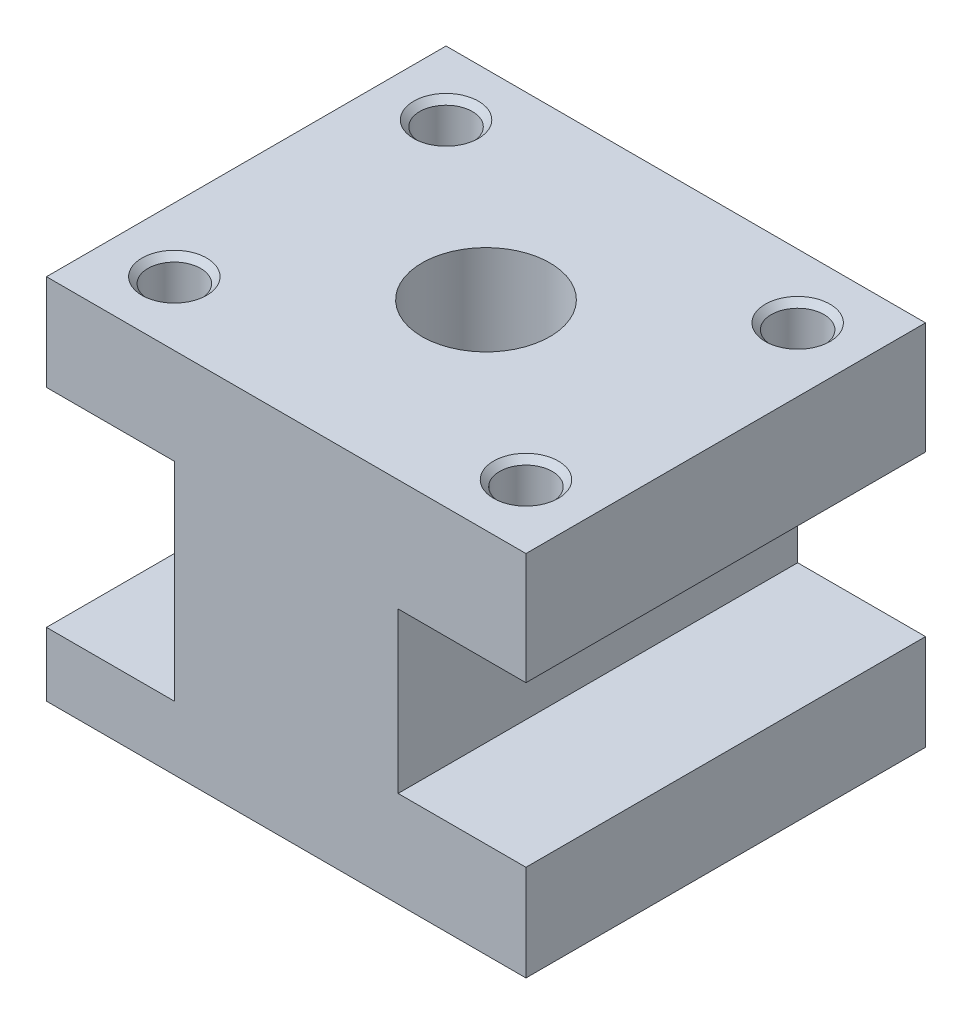
ISO-10303-21;
HEADER;
FILE_DESCRIPTION(('STEP AP214'),'2;1');
FILE_NAME('part.step','',(''),(''),'','','');
FILE_SCHEMA(('AUTOMOTIVE_DESIGN { 1 0 10303 214 1 1 1 1 }'));
ENDSEC;
DATA;
#1=APPLICATION_CONTEXT('core data for automotive mechanical design processes');
#2=APPLICATION_PROTOCOL_DEFINITION('international standard','automotive_design',2000,#1);
#3=PRODUCT_CONTEXT('',#1,'mechanical');
#4=PRODUCT('Part','Part','',(#3));
#5=PRODUCT_RELATED_PRODUCT_CATEGORY('part','',(#4));
#6=PRODUCT_DEFINITION_FORMATION('','',#4);
#7=PRODUCT_DEFINITION_CONTEXT('part definition',#1,'design');
#8=PRODUCT_DEFINITION('design','',#6,#7);
#9=PRODUCT_DEFINITION_SHAPE('','',#8);
#10=(LENGTH_UNIT() NAMED_UNIT(*) SI_UNIT(.MILLI.,.METRE.));
#11=(NAMED_UNIT(*) PLANE_ANGLE_UNIT() SI_UNIT($,.RADIAN.));
#12=(NAMED_UNIT(*) SI_UNIT($,.STERADIAN.) SOLID_ANGLE_UNIT());
#13=UNCERTAINTY_MEASURE_WITH_UNIT(LENGTH_MEASURE(1.E-05),#10,'distance_accuracy_value','');
#14=(GEOMETRIC_REPRESENTATION_CONTEXT(3) GLOBAL_UNCERTAINTY_ASSIGNED_CONTEXT((#13)) GLOBAL_UNIT_ASSIGNED_CONTEXT((#10,
#11,#12)) REPRESENTATION_CONTEXT('',''));
#15=CARTESIAN_POINT('',(0.,0.,0.));
#16=DIRECTION('',(0.,0.,1.));
#17=DIRECTION('',(1.,0.,0.));
#18=AXIS2_PLACEMENT_3D('',#15,#16,#17);
#19=CARTESIAN_POINT('',(15.,23.,12.5));
#20=DIRECTION('',(0.,-1.,0.));
#21=DIRECTION('',(0.,0.,-1.));
#22=AXIS2_PLACEMENT_3D('',#19,#20,#21);
#23=PLANE('',#22);
#24=CARTESIAN_POINT('',(0.,23.,0.));
#25=DIRECTION('',(0.,1.,0.));
#26=DIRECTION('',(0.,0.,1.));
#27=AXIS2_PLACEMENT_3D('',#24,#25,#26);
#28=CIRCLE('',#27,4.);
#29=CARTESIAN_POINT('',(0.,23.,4.));
#30=VERTEX_POINT('',#29);
#31=EDGE_CURVE('E292',#30,#30,#28,.T.);
#32=ORIENTED_EDGE('',*,*,#31,.F.);
#33=EDGE_LOOP('',(#32));
#34=FACE_BOUND('',#33,.T.);
#35=CARTESIAN_POINT('',(11.,23.,8.5));
#36=DIRECTION('',(0.,1.,0.));
#37=DIRECTION('',(0.,0.,1.));
#38=AXIS2_PLACEMENT_3D('',#35,#36,#37);
#39=CIRCLE('',#38,2.025);
#40=CARTESIAN_POINT('',(11.,23.,10.525));
#41=VERTEX_POINT('',#40);
#42=EDGE_CURVE('E305',#41,#41,#39,.T.);
#43=ORIENTED_EDGE('',*,*,#42,.F.);
#44=EDGE_LOOP('',(#43));
#45=FACE_BOUND('',#44,.T.);
#46=CARTESIAN_POINT('',(11.,23.,-8.5));
#47=DIRECTION('',(0.,1.,0.));
#48=DIRECTION('',(0.,0.,1.));
#49=AXIS2_PLACEMENT_3D('',#46,#47,#48);
#50=CIRCLE('',#49,2.025);
#51=CARTESIAN_POINT('',(11.,23.,-6.475));
#52=VERTEX_POINT('',#51);
#53=EDGE_CURVE('E323',#52,#52,#50,.T.);
#54=ORIENTED_EDGE('',*,*,#53,.F.);
#55=EDGE_LOOP('',(#54));
#56=FACE_BOUND('',#55,.T.);
#57=DIRECTION('',(-1.,0.,0.));
#58=VECTOR('',#57,1.);
#59=CARTESIAN_POINT('',(15.,23.,-12.5));
#60=LINE('',#59,#58);
#61=CARTESIAN_POINT('',(15.,23.,-12.5));
#62=VERTEX_POINT('',#61);
#63=CARTESIAN_POINT('',(-15.,23.,-12.5));
#64=VERTEX_POINT('',#63);
#65=EDGE_CURVE('E174',#62,#64,#60,.T.);
#66=ORIENTED_EDGE('',*,*,#65,.T.);
#67=DIRECTION('',(0.,0.,-1.));
#68=VECTOR('',#67,1.);
#69=CARTESIAN_POINT('',(-15.,23.,12.5));
#70=LINE('',#69,#68);
#71=CARTESIAN_POINT('',(-15.,23.,12.5));
#72=VERTEX_POINT('',#71);
#73=EDGE_CURVE('E185',#72,#64,#70,.T.);
#74=ORIENTED_EDGE('',*,*,#73,.F.);
#75=DIRECTION('',(-1.,0.,0.));
#76=VECTOR('',#75,1.);
#77=CARTESIAN_POINT('',(15.,23.,12.5));
#78=LINE('',#77,#76);
#79=CARTESIAN_POINT('',(15.,23.,12.5));
#80=VERTEX_POINT('',#79);
#81=EDGE_CURVE('E234',#80,#72,#78,.T.);
#82=ORIENTED_EDGE('',*,*,#81,.F.);
#83=DIRECTION('',(0.,0.,-1.));
#84=VECTOR('',#83,1.);
#85=CARTESIAN_POINT('',(15.,23.,12.5));
#86=LINE('',#85,#84);
#87=EDGE_CURVE('E188',#80,#62,#86,.T.);
#88=ORIENTED_EDGE('',*,*,#87,.T.);
#89=EDGE_LOOP('',(#66,#74,#82,#88));
#90=FACE_BOUND('',#89,.T.);
#91=CARTESIAN_POINT('',(-11.,23.,-8.5));
#92=DIRECTION('',(0.,1.,0.));
#93=DIRECTION('',(0.,0.,1.));
#94=AXIS2_PLACEMENT_3D('',#91,#92,#93);
#95=CIRCLE('',#94,2.025);
#96=CARTESIAN_POINT('',(-11.,23.,-6.475));
#97=VERTEX_POINT('',#96);
#98=EDGE_CURVE('E314',#97,#97,#95,.T.);
#99=ORIENTED_EDGE('',*,*,#98,.F.);
#100=EDGE_LOOP('',(#99));
#101=FACE_BOUND('',#100,.T.);
#102=CARTESIAN_POINT('',(-11.,23.,8.5));
#103=DIRECTION('',(0.,1.,0.));
#104=DIRECTION('',(0.,0.,1.));
#105=AXIS2_PLACEMENT_3D('',#102,#103,#104);
#106=CIRCLE('',#105,2.025);
#107=CARTESIAN_POINT('',(-11.,23.,10.525));
#108=VERTEX_POINT('',#107);
#109=EDGE_CURVE('E291',#108,#108,#106,.T.);
#110=ORIENTED_EDGE('',*,*,#109,.F.);
#111=EDGE_LOOP('',(#110));
#112=FACE_BOUND('',#111,.T.);
#113=ADVANCED_FACE('F37',(#34,#45,#56,#90,#101,#112),#23,.F.);
#114=CARTESIAN_POINT('',(-15.,4.,12.5));
#115=DIRECTION('',(1.,0.,0.));
#116=DIRECTION('',(0.,0.,-1.));
#117=AXIS2_PLACEMENT_3D('',#114,#115,#116);
#118=PLANE('',#117);
#119=DIRECTION('',(0.,-1.,0.));
#120=VECTOR('',#119,1.);
#121=CARTESIAN_POINT('',(-15.,4.,-12.5));
#122=LINE('',#121,#120);
#123=CARTESIAN_POINT('',(-15.,4.,-12.5));
#124=VERTEX_POINT('',#123);
#125=CARTESIAN_POINT('',(-15.,0.,-12.5));
#126=VERTEX_POINT('',#125);
#127=EDGE_CURVE('E158',#124,#126,#122,.T.);
#128=ORIENTED_EDGE('',*,*,#127,.T.);
#129=DIRECTION('',(0.,0.,-1.));
#130=VECTOR('',#129,1.);
#131=CARTESIAN_POINT('',(-15.,0.,12.5));
#132=LINE('',#131,#130);
#133=CARTESIAN_POINT('',(-15.,0.,12.5));
#134=VERTEX_POINT('',#133);
#135=EDGE_CURVE('E11',#134,#126,#132,.T.);
#136=ORIENTED_EDGE('',*,*,#135,.F.);
#137=DIRECTION('',(0.,-1.,0.));
#138=VECTOR('',#137,1.);
#139=CARTESIAN_POINT('',(-15.,4.,12.5));
#140=LINE('',#139,#138);
#141=CARTESIAN_POINT('',(-15.,4.,12.5));
#142=VERTEX_POINT('',#141);
#143=EDGE_CURVE('E181',#142,#134,#140,.T.);
#144=ORIENTED_EDGE('',*,*,#143,.F.);
#145=DIRECTION('',(0.,0.,-1.));
#146=VECTOR('',#145,1.);
#147=CARTESIAN_POINT('',(-15.,4.,12.5));
#148=LINE('',#147,#146);
#149=EDGE_CURVE('E154',#142,#124,#148,.T.);
#150=ORIENTED_EDGE('',*,*,#149,.T.);
#151=EDGE_LOOP('',(#128,#136,#144,#150));
#152=FACE_BOUND('',#151,.T.);
#153=ADVANCED_FACE('F39',(#152),#118,.F.);
#154=CARTESIAN_POINT('',(-15.,0.,12.5));
#155=DIRECTION('',(0.,1.,0.));
#156=DIRECTION('',(-1.,0.,0.));
#157=AXIS2_PLACEMENT_3D('',#154,#155,#156);
#158=PLANE('',#157);
#159=CARTESIAN_POINT('',(0.,0.,0.));
#160=DIRECTION('',(0.,1.,0.));
#161=DIRECTION('',(0.,0.,1.));
#162=AXIS2_PLACEMENT_3D('',#159,#160,#161);
#163=CIRCLE('',#162,3.99999999999999);
#164=CARTESIAN_POINT('',(0.,0.,3.99999999999999));
#165=VERTEX_POINT('',#164);
#166=EDGE_CURVE('E289',#165,#165,#163,.T.);
#167=ORIENTED_EDGE('',*,*,#166,.T.);
#168=EDGE_LOOP('',(#167));
#169=FACE_BOUND('',#168,.T.);
#170=DIRECTION('',(1.,0.,0.));
#171=VECTOR('',#170,1.);
#172=CARTESIAN_POINT('',(-15.,0.,-12.5));
#173=LINE('',#172,#171);
#174=CARTESIAN_POINT('',(15.,0.,-12.5));
#175=VERTEX_POINT('',#174);
#176=EDGE_CURVE('E161',#126,#175,#173,.T.);
#177=ORIENTED_EDGE('',*,*,#176,.T.);
#178=DIRECTION('',(0.,0.,-1.));
#179=VECTOR('',#178,1.);
#180=CARTESIAN_POINT('',(15.,0.,12.5));
#181=LINE('',#180,#179);
#182=CARTESIAN_POINT('',(15.,0.,12.5));
#183=VERTEX_POINT('',#182);
#184=EDGE_CURVE('E46',#183,#175,#181,.T.);
#185=ORIENTED_EDGE('',*,*,#184,.F.);
#186=DIRECTION('',(1.,0.,0.));
#187=VECTOR('',#186,1.);
#188=CARTESIAN_POINT('',(-15.,0.,12.5));
#189=LINE('',#188,#187);
#190=EDGE_CURVE('E109',#134,#183,#189,.T.);
#191=ORIENTED_EDGE('',*,*,#190,.F.);
#192=ORIENTED_EDGE('',*,*,#135,.T.);
#193=EDGE_LOOP('',(#177,#185,#191,#192));
#194=FACE_BOUND('',#193,.T.);
#195=ADVANCED_FACE('F264',(#169,#194),#158,.F.);
#196=CARTESIAN_POINT('',(15.,0.,12.5));
#197=DIRECTION('',(-1.,0.,0.));
#198=DIRECTION('',(0.,0.,1.));
#199=AXIS2_PLACEMENT_3D('',#196,#197,#198);
#200=PLANE('',#199);
#201=DIRECTION('',(0.,1.,0.));
#202=VECTOR('',#201,1.);
#203=CARTESIAN_POINT('',(15.,0.,-12.5));
#204=LINE('',#203,#202);
#205=CARTESIAN_POINT('',(15.,6.00000000000001,-12.5));
#206=VERTEX_POINT('',#205);
#207=EDGE_CURVE('E164',#175,#206,#204,.T.);
#208=ORIENTED_EDGE('',*,*,#207,.T.);
#209=DIRECTION('',(0.,0.,-1.));
#210=VECTOR('',#209,1.);
#211=CARTESIAN_POINT('',(15.,6.00000000000001,12.5));
#212=LINE('',#211,#210);
#213=CARTESIAN_POINT('',(15.,6.00000000000001,12.5));
#214=VERTEX_POINT('',#213);
#215=EDGE_CURVE('E200',#214,#206,#212,.T.);
#216=ORIENTED_EDGE('',*,*,#215,.F.);
#217=DIRECTION('',(0.,1.,0.));
#218=VECTOR('',#217,1.);
#219=CARTESIAN_POINT('',(15.,0.,12.5));
#220=LINE('',#219,#218);
#221=EDGE_CURVE('E208',#183,#214,#220,.T.);
#222=ORIENTED_EDGE('',*,*,#221,.F.);
#223=ORIENTED_EDGE('',*,*,#184,.T.);
#224=EDGE_LOOP('',(#208,#216,#222,#223));
#225=FACE_BOUND('',#224,.T.);
#226=ADVANCED_FACE('F206',(#225),#200,.F.);
#227=CARTESIAN_POINT('',(15.,6.00000000000001,12.5));
#228=DIRECTION('',(0.,-1.,0.));
#229=DIRECTION('',(1.,0.,0.));
#230=AXIS2_PLACEMENT_3D('',#227,#228,#229);
#231=PLANE('',#230);
#232=DIRECTION('',(-1.,0.,0.));
#233=VECTOR('',#232,1.);
#234=CARTESIAN_POINT('',(15.,6.00000000000001,-12.5));
#235=LINE('',#234,#233);
#236=CARTESIAN_POINT('',(7.,6.,-12.5));
#237=VERTEX_POINT('',#236);
#238=EDGE_CURVE('E166',#206,#237,#235,.T.);
#239=ORIENTED_EDGE('',*,*,#238,.T.);
#240=DIRECTION('',(0.,0.,-1.));
#241=VECTOR('',#240,1.);
#242=CARTESIAN_POINT('',(7.,6.,12.5));
#243=LINE('',#242,#241);
#244=CARTESIAN_POINT('',(7.,6.,12.5));
#245=VERTEX_POINT('',#244);
#246=EDGE_CURVE('E197',#245,#237,#243,.T.);
#247=ORIENTED_EDGE('',*,*,#246,.F.);
#248=DIRECTION('',(-1.,0.,0.));
#249=VECTOR('',#248,1.);
#250=CARTESIAN_POINT('',(15.,6.00000000000001,12.5));
#251=LINE('',#250,#249);
#252=EDGE_CURVE('E226',#214,#245,#251,.T.);
#253=ORIENTED_EDGE('',*,*,#252,.F.);
#254=ORIENTED_EDGE('',*,*,#215,.T.);
#255=EDGE_LOOP('',(#239,#247,#253,#254));
#256=FACE_BOUND('',#255,.T.);
#257=ADVANCED_FACE('F217',(#256),#231,.F.);
#258=CARTESIAN_POINT('',(7.,6.,12.5));
#259=DIRECTION('',(-1.,0.,0.));
#260=DIRECTION('',(0.,0.,1.));
#261=AXIS2_PLACEMENT_3D('',#258,#259,#260);
#262=PLANE('',#261);
#263=DIRECTION('',(0.,1.,0.));
#264=VECTOR('',#263,1.);
#265=CARTESIAN_POINT('',(7.,6.,-12.5));
#266=LINE('',#265,#264);
#267=CARTESIAN_POINT('',(7.,16.,-12.5));
#268=VERTEX_POINT('',#267);
#269=EDGE_CURVE('E168',#237,#268,#266,.T.);
#270=ORIENTED_EDGE('',*,*,#269,.T.);
#271=DIRECTION('',(0.,0.,-1.));
#272=VECTOR('',#271,1.);
#273=CARTESIAN_POINT('',(7.,16.,12.5));
#274=LINE('',#273,#272);
#275=CARTESIAN_POINT('',(7.,16.,12.5));
#276=VERTEX_POINT('',#275);
#277=EDGE_CURVE('E194',#276,#268,#274,.T.);
#278=ORIENTED_EDGE('',*,*,#277,.F.);
#279=DIRECTION('',(0.,1.,0.));
#280=VECTOR('',#279,1.);
#281=CARTESIAN_POINT('',(7.,6.,12.5));
#282=LINE('',#281,#280);
#283=EDGE_CURVE('E223',#245,#276,#282,.T.);
#284=ORIENTED_EDGE('',*,*,#283,.F.);
#285=ORIENTED_EDGE('',*,*,#246,.T.);
#286=EDGE_LOOP('',(#270,#278,#284,#285));
#287=FACE_BOUND('',#286,.T.);
#288=ADVANCED_FACE('F221',(#287),#262,.F.);
#289=CARTESIAN_POINT('',(7.,16.,12.5));
#290=DIRECTION('',(0.,1.,0.));
#291=DIRECTION('',(0.,0.,1.));
#292=AXIS2_PLACEMENT_3D('',#289,#290,#291);
#293=PLANE('',#292);
#294=CARTESIAN_POINT('',(11.,16.,8.5));
#295=DIRECTION('',(0.,1.,0.));
#296=DIRECTION('',(0.,0.,1.));
#297=AXIS2_PLACEMENT_3D('',#294,#295,#296);
#298=CIRCLE('',#297,1.65);
#299=CARTESIAN_POINT('',(11.,16.,10.15));
#300=VERTEX_POINT('',#299);
#301=EDGE_CURVE('E311',#300,#300,#298,.T.);
#302=ORIENTED_EDGE('',*,*,#301,.T.);
#303=EDGE_LOOP('',(#302));
#304=FACE_BOUND('',#303,.T.);
#305=CARTESIAN_POINT('',(11.,16.,-8.5));
#306=DIRECTION('',(0.,1.,0.));
#307=DIRECTION('',(0.,0.,1.));
#308=AXIS2_PLACEMENT_3D('',#305,#306,#307);
#309=CIRCLE('',#308,1.65);
#310=CARTESIAN_POINT('',(11.,16.,-6.85));
#311=VERTEX_POINT('',#310);
#312=EDGE_CURVE('E162',#311,#311,#309,.T.);
#313=ORIENTED_EDGE('',*,*,#312,.T.);
#314=EDGE_LOOP('',(#313));
#315=FACE_BOUND('',#314,.T.);
#316=DIRECTION('',(1.,0.,0.));
#317=VECTOR('',#316,1.);
#318=CARTESIAN_POINT('',(7.,16.,-12.5));
#319=LINE('',#318,#317);
#320=CARTESIAN_POINT('',(15.,16.,-12.5));
#321=VERTEX_POINT('',#320);
#322=EDGE_CURVE('E170',#268,#321,#319,.T.);
#323=ORIENTED_EDGE('',*,*,#322,.T.);
#324=DIRECTION('',(0.,0.,-1.));
#325=VECTOR('',#324,1.);
#326=CARTESIAN_POINT('',(15.,16.,12.5));
#327=LINE('',#326,#325);
#328=CARTESIAN_POINT('',(15.,16.,12.5));
#329=VERTEX_POINT('',#328);
#330=EDGE_CURVE('E191',#329,#321,#327,.T.);
#331=ORIENTED_EDGE('',*,*,#330,.F.);
#332=DIRECTION('',(1.,0.,0.));
#333=VECTOR('',#332,1.);
#334=CARTESIAN_POINT('',(7.,16.,12.5));
#335=LINE('',#334,#333);
#336=EDGE_CURVE('E225',#276,#329,#335,.T.);
#337=ORIENTED_EDGE('',*,*,#336,.F.);
#338=ORIENTED_EDGE('',*,*,#277,.T.);
#339=EDGE_LOOP('',(#323,#331,#337,#338));
#340=FACE_BOUND('',#339,.T.);
#341=ADVANCED_FACE('F273',(#304,#315,#340),#293,.F.);
#342=CARTESIAN_POINT('',(15.,16.,12.5));
#343=DIRECTION('',(-1.,0.,0.));
#344=DIRECTION('',(0.,0.,1.));
#345=AXIS2_PLACEMENT_3D('',#342,#343,#344);
#346=PLANE('',#345);
#347=DIRECTION('',(0.,1.,0.));
#348=VECTOR('',#347,1.);
#349=CARTESIAN_POINT('',(15.,16.,-12.5));
#350=LINE('',#349,#348);
#351=EDGE_CURVE('E172',#321,#62,#350,.T.);
#352=ORIENTED_EDGE('',*,*,#351,.T.);
#353=ORIENTED_EDGE('',*,*,#87,.F.);
#354=DIRECTION('',(0.,1.,0.));
#355=VECTOR('',#354,1.);
#356=CARTESIAN_POINT('',(15.,16.,12.5));
#357=LINE('',#356,#355);
#358=EDGE_CURVE('E228',#329,#80,#357,.T.);
#359=ORIENTED_EDGE('',*,*,#358,.F.);
#360=ORIENTED_EDGE('',*,*,#330,.T.);
#361=EDGE_LOOP('',(#352,#353,#359,#360));
#362=FACE_BOUND('',#361,.T.);
#363=ADVANCED_FACE('F270',(#362),#346,.F.);
#364=CARTESIAN_POINT('',(-15.,23.,12.5));
#365=DIRECTION('',(1.,0.,0.));
#366=DIRECTION('',(0.,0.,-1.));
#367=AXIS2_PLACEMENT_3D('',#364,#365,#366);
#368=PLANE('',#367);
#369=DIRECTION('',(0.,-1.,0.));
#370=VECTOR('',#369,1.);
#371=CARTESIAN_POINT('',(-15.,23.,-12.5));
#372=LINE('',#371,#370);
#373=CARTESIAN_POINT('',(-15.,17.,-12.5));
#374=VERTEX_POINT('',#373);
#375=EDGE_CURVE('E176',#64,#374,#372,.T.);
#376=ORIENTED_EDGE('',*,*,#375,.T.);
#377=DIRECTION('',(0.,0.,-1.));
#378=VECTOR('',#377,1.);
#379=CARTESIAN_POINT('',(-15.,17.,12.5));
#380=LINE('',#379,#378);
#381=CARTESIAN_POINT('',(-15.,17.,12.5));
#382=VERTEX_POINT('',#381);
#383=EDGE_CURVE('E149',#382,#374,#380,.T.);
#384=ORIENTED_EDGE('',*,*,#383,.F.);
#385=DIRECTION('',(0.,-1.,0.));
#386=VECTOR('',#385,1.);
#387=CARTESIAN_POINT('',(-15.,23.,12.5));
#388=LINE('',#387,#386);
#389=EDGE_CURVE('E140',#72,#382,#388,.T.);
#390=ORIENTED_EDGE('',*,*,#389,.F.);
#391=ORIENTED_EDGE('',*,*,#73,.T.);
#392=EDGE_LOOP('',(#376,#384,#390,#391));
#393=FACE_BOUND('',#392,.T.);
#394=ADVANCED_FACE('F244',(#393),#368,.F.);
#395=CARTESIAN_POINT('',(-15.,17.,12.5));
#396=DIRECTION('',(0.,1.,0.));
#397=DIRECTION('',(0.,0.,1.));
#398=AXIS2_PLACEMENT_3D('',#395,#396,#397);
#399=PLANE('',#398);
#400=CARTESIAN_POINT('',(-11.,17.,8.5));
#401=DIRECTION('',(0.,1.,0.));
#402=DIRECTION('',(0.,0.,1.));
#403=AXIS2_PLACEMENT_3D('',#400,#401,#402);
#404=CIRCLE('',#403,1.65);
#405=CARTESIAN_POINT('',(-11.,17.,10.15));
#406=VERTEX_POINT('',#405);
#407=EDGE_CURVE('E302',#406,#406,#404,.T.);
#408=ORIENTED_EDGE('',*,*,#407,.T.);
#409=EDGE_LOOP('',(#408));
#410=FACE_BOUND('',#409,.T.);
#411=CARTESIAN_POINT('',(-11.,17.,-8.5));
#412=DIRECTION('',(0.,1.,0.));
#413=DIRECTION('',(0.,0.,1.));
#414=AXIS2_PLACEMENT_3D('',#411,#412,#413);
#415=CIRCLE('',#414,1.65);
#416=CARTESIAN_POINT('',(-11.,17.,-6.85));
#417=VERTEX_POINT('',#416);
#418=EDGE_CURVE('E320',#417,#417,#415,.T.);
#419=ORIENTED_EDGE('',*,*,#418,.T.);
#420=EDGE_LOOP('',(#419));
#421=FACE_BOUND('',#420,.T.);
#422=DIRECTION('',(1.,0.,0.));
#423=VECTOR('',#422,1.);
#424=CARTESIAN_POINT('',(-15.,17.,-12.5));
#425=LINE('',#424,#423);
#426=CARTESIAN_POINT('',(-7.,17.,-12.5));
#427=VERTEX_POINT('',#426);
#428=EDGE_CURVE('E148',#374,#427,#425,.T.);
#429=ORIENTED_EDGE('',*,*,#428,.T.);
#430=DIRECTION('',(0.,0.,-1.));
#431=VECTOR('',#430,1.);
#432=CARTESIAN_POINT('',(-7.,17.,12.5));
#433=LINE('',#432,#431);
#434=CARTESIAN_POINT('',(-7.,17.,12.5));
#435=VERTEX_POINT('',#434);
#436=EDGE_CURVE('E145',#435,#427,#433,.T.);
#437=ORIENTED_EDGE('',*,*,#436,.F.);
#438=DIRECTION('',(1.,0.,0.));
#439=VECTOR('',#438,1.);
#440=CARTESIAN_POINT('',(-15.,17.,12.5));
#441=LINE('',#440,#439);
#442=EDGE_CURVE('E134',#382,#435,#441,.T.);
#443=ORIENTED_EDGE('',*,*,#442,.F.);
#444=ORIENTED_EDGE('',*,*,#383,.T.);
#445=EDGE_LOOP('',(#429,#437,#443,#444));
#446=FACE_BOUND('',#445,.T.);
#447=ADVANCED_FACE('F146',(#410,#421,#446),#399,.F.);
#448=CARTESIAN_POINT('',(-7.,17.,12.5));
#449=DIRECTION('',(1.,0.,0.));
#450=DIRECTION('',(0.,1.,0.));
#451=AXIS2_PLACEMENT_3D('',#448,#449,#450);
#452=PLANE('',#451);
#453=DIRECTION('',(0.,-1.,0.));
#454=VECTOR('',#453,1.);
#455=CARTESIAN_POINT('',(-7.,17.,-12.5));
#456=LINE('',#455,#454);
#457=CARTESIAN_POINT('',(-7.,4.,-12.5));
#458=VERTEX_POINT('',#457);
#459=EDGE_CURVE('E95',#427,#458,#456,.T.);
#460=ORIENTED_EDGE('',*,*,#459,.T.);
#461=DIRECTION('',(0.,0.,-1.));
#462=VECTOR('',#461,1.);
#463=CARTESIAN_POINT('',(-7.,4.,12.5));
#464=LINE('',#463,#462);
#465=CARTESIAN_POINT('',(-7.,4.,12.5));
#466=VERTEX_POINT('',#465);
#467=EDGE_CURVE('E150',#466,#458,#464,.T.);
#468=ORIENTED_EDGE('',*,*,#467,.F.);
#469=DIRECTION('',(0.,-1.,0.));
#470=VECTOR('',#469,1.);
#471=CARTESIAN_POINT('',(-7.,17.,12.5));
#472=LINE('',#471,#470);
#473=EDGE_CURVE('E138',#435,#466,#472,.T.);
#474=ORIENTED_EDGE('',*,*,#473,.F.);
#475=ORIENTED_EDGE('',*,*,#436,.T.);
#476=EDGE_LOOP('',(#460,#468,#474,#475));
#477=FACE_BOUND('',#476,.T.);
#478=ADVANCED_FACE('F152',(#477),#452,.F.);
#479=CARTESIAN_POINT('',(-7.,4.,12.5));
#480=DIRECTION('',(0.,-1.,0.));
#481=DIRECTION('',(1.,0.,0.));
#482=AXIS2_PLACEMENT_3D('',#479,#480,#481);
#483=PLANE('',#482);
#484=DIRECTION('',(-1.,0.,0.));
#485=VECTOR('',#484,1.);
#486=CARTESIAN_POINT('',(-7.,4.,-12.5));
#487=LINE('',#486,#485);
#488=EDGE_CURVE('E101',#458,#124,#487,.T.);
#489=ORIENTED_EDGE('',*,*,#488,.T.);
#490=ORIENTED_EDGE('',*,*,#149,.F.);
#491=DIRECTION('',(-1.,0.,0.));
#492=VECTOR('',#491,1.);
#493=CARTESIAN_POINT('',(-7.,4.,12.5));
#494=LINE('',#493,#492);
#495=EDGE_CURVE('E54',#466,#142,#494,.T.);
#496=ORIENTED_EDGE('',*,*,#495,.F.);
#497=ORIENTED_EDGE('',*,*,#467,.T.);
#498=EDGE_LOOP('',(#489,#490,#496,#497));
#499=FACE_BOUND('',#498,.T.);
#500=ADVANCED_FACE('F248',(#499),#483,.F.);
#501=CARTESIAN_POINT('',(0.,0.,12.5));
#502=DIRECTION('',(0.,0.,1.));
#503=DIRECTION('',(1.,0.,0.));
#504=AXIS2_PLACEMENT_3D('',#501,#502,#503);
#505=PLANE('',#504);
#506=ORIENTED_EDGE('',*,*,#143,.T.);
#507=ORIENTED_EDGE('',*,*,#190,.T.);
#508=ORIENTED_EDGE('',*,*,#221,.T.);
#509=ORIENTED_EDGE('',*,*,#252,.T.);
#510=ORIENTED_EDGE('',*,*,#283,.T.);
#511=ORIENTED_EDGE('',*,*,#336,.T.);
#512=ORIENTED_EDGE('',*,*,#358,.T.);
#513=ORIENTED_EDGE('',*,*,#81,.T.);
#514=ORIENTED_EDGE('',*,*,#389,.T.);
#515=ORIENTED_EDGE('',*,*,#442,.T.);
#516=ORIENTED_EDGE('',*,*,#473,.T.);
#517=ORIENTED_EDGE('',*,*,#495,.T.);
#518=EDGE_LOOP('',(#506,#507,#508,#509,#510,#511,#512,#513,#514,#515,#516,#517));
#519=FACE_BOUND('',#518,.T.);
#520=ADVANCED_FACE('F136',(#519),#505,.T.);
#521=CARTESIAN_POINT('',(0.,0.,-12.5));
#522=DIRECTION('',(0.,0.,1.));
#523=DIRECTION('',(1.,0.,0.));
#524=AXIS2_PLACEMENT_3D('',#521,#522,#523);
#525=PLANE('',#524);
#526=ORIENTED_EDGE('',*,*,#127,.F.);
#527=ORIENTED_EDGE('',*,*,#488,.F.);
#528=ORIENTED_EDGE('',*,*,#459,.F.);
#529=ORIENTED_EDGE('',*,*,#428,.F.);
#530=ORIENTED_EDGE('',*,*,#375,.F.);
#531=ORIENTED_EDGE('',*,*,#65,.F.);
#532=ORIENTED_EDGE('',*,*,#351,.F.);
#533=ORIENTED_EDGE('',*,*,#322,.F.);
#534=ORIENTED_EDGE('',*,*,#269,.F.);
#535=ORIENTED_EDGE('',*,*,#238,.F.);
#536=ORIENTED_EDGE('',*,*,#207,.F.);
#537=ORIENTED_EDGE('',*,*,#176,.F.);
#538=EDGE_LOOP('',(#526,#527,#528,#529,#530,#531,#532,#533,#534,#535,#536,#537));
#539=FACE_BOUND('',#538,.T.);
#540=ADVANCED_FACE('F212',(#539),#525,.F.);
#541=CARTESIAN_POINT('',(11.,23.,-8.5));
#542=DIRECTION('',(0.,1.,0.));
#543=DIRECTION('',(0.,0.,1.));
#544=AXIS2_PLACEMENT_3D('',#541,#542,#543);
#545=CYLINDRICAL_SURFACE('',#544,1.65);
#546=ORIENTED_EDGE('',*,*,#312,.F.);
#547=EDGE_LOOP('',(#546));
#548=FACE_BOUND('',#547,.T.);
#549=CARTESIAN_POINT('',(11.,22.625,-8.5));
#550=DIRECTION('',(0.,1.,0.));
#551=DIRECTION('',(0.,0.,1.));
#552=AXIS2_PLACEMENT_3D('',#549,#550,#551);
#553=CIRCLE('',#552,1.65);
#554=CARTESIAN_POINT('',(11.,22.625,-6.85));
#555=VERTEX_POINT('',#554);
#556=EDGE_CURVE('E326',#555,#555,#553,.T.);
#557=ORIENTED_EDGE('',*,*,#556,.T.);
#558=EDGE_LOOP('',(#557));
#559=FACE_BOUND('',#558,.T.);
#560=ADVANCED_FACE('F336',(#548,#559),#545,.F.);
#561=CARTESIAN_POINT('',(11.,23.,-8.5));
#562=DIRECTION('',(0.,1.,0.));
#563=DIRECTION('',(0.,0.,1.));
#564=AXIS2_PLACEMENT_3D('',#561,#562,#563);
#565=CONICAL_SURFACE('',#564,2.025,0.785398163397439);
#566=ORIENTED_EDGE('',*,*,#556,.F.);
#567=EDGE_LOOP('',(#566));
#568=FACE_BOUND('',#567,.T.);
#569=ORIENTED_EDGE('',*,*,#53,.T.);
#570=EDGE_LOOP('',(#569));
#571=FACE_BOUND('',#570,.T.);
#572=ADVANCED_FACE('F339',(#568,#571),#565,.F.);
#573=CARTESIAN_POINT('',(-11.,23.,-8.5));
#574=DIRECTION('',(0.,1.,0.));
#575=DIRECTION('',(0.,0.,1.));
#576=AXIS2_PLACEMENT_3D('',#573,#574,#575);
#577=CYLINDRICAL_SURFACE('',#576,1.65);
#578=ORIENTED_EDGE('',*,*,#418,.F.);
#579=EDGE_LOOP('',(#578));
#580=FACE_BOUND('',#579,.T.);
#581=CARTESIAN_POINT('',(-11.,22.625,-8.5));
#582=DIRECTION('',(0.,1.,0.));
#583=DIRECTION('',(0.,0.,1.));
#584=AXIS2_PLACEMENT_3D('',#581,#582,#583);
#585=CIRCLE('',#584,1.65);
#586=CARTESIAN_POINT('',(-11.,22.625,-6.85));
#587=VERTEX_POINT('',#586);
#588=EDGE_CURVE('E317',#587,#587,#585,.T.);
#589=ORIENTED_EDGE('',*,*,#588,.T.);
#590=EDGE_LOOP('',(#589));
#591=FACE_BOUND('',#590,.T.);
#592=ADVANCED_FACE('F345',(#580,#591),#577,.F.);
#593=CARTESIAN_POINT('',(-11.,23.,-8.5));
#594=DIRECTION('',(0.,1.,0.));
#595=DIRECTION('',(0.,0.,1.));
#596=AXIS2_PLACEMENT_3D('',#593,#594,#595);
#597=CONICAL_SURFACE('',#596,2.025,0.785398163397439);
#598=ORIENTED_EDGE('',*,*,#588,.F.);
#599=EDGE_LOOP('',(#598));
#600=FACE_BOUND('',#599,.T.);
#601=ORIENTED_EDGE('',*,*,#98,.T.);
#602=EDGE_LOOP('',(#601));
#603=FACE_BOUND('',#602,.T.);
#604=ADVANCED_FACE('F352',(#600,#603),#597,.F.);
#605=CARTESIAN_POINT('',(11.,23.,8.5));
#606=DIRECTION('',(0.,1.,0.));
#607=DIRECTION('',(0.,0.,1.));
#608=AXIS2_PLACEMENT_3D('',#605,#606,#607);
#609=CYLINDRICAL_SURFACE('',#608,1.65);
#610=ORIENTED_EDGE('',*,*,#301,.F.);
#611=EDGE_LOOP('',(#610));
#612=FACE_BOUND('',#611,.T.);
#613=CARTESIAN_POINT('',(11.,22.625,8.5));
#614=DIRECTION('',(0.,1.,0.));
#615=DIRECTION('',(0.,0.,1.));
#616=AXIS2_PLACEMENT_3D('',#613,#614,#615);
#617=CIRCLE('',#616,1.65);
#618=CARTESIAN_POINT('',(11.,22.625,10.15));
#619=VERTEX_POINT('',#618);
#620=EDGE_CURVE('E308',#619,#619,#617,.T.);
#621=ORIENTED_EDGE('',*,*,#620,.T.);
#622=EDGE_LOOP('',(#621));
#623=FACE_BOUND('',#622,.T.);
#624=ADVANCED_FACE('F381',(#612,#623),#609,.F.);
#625=CARTESIAN_POINT('',(11.,23.,8.5));
#626=DIRECTION('',(0.,1.,0.));
#627=DIRECTION('',(0.,0.,1.));
#628=AXIS2_PLACEMENT_3D('',#625,#626,#627);
#629=CONICAL_SURFACE('',#628,2.025,0.785398163397439);
#630=ORIENTED_EDGE('',*,*,#620,.F.);
#631=EDGE_LOOP('',(#630));
#632=FACE_BOUND('',#631,.T.);
#633=ORIENTED_EDGE('',*,*,#42,.T.);
#634=EDGE_LOOP('',(#633));
#635=FACE_BOUND('',#634,.T.);
#636=ADVANCED_FACE('F375',(#632,#635),#629,.F.);
#637=CARTESIAN_POINT('',(-11.,23.,8.5));
#638=DIRECTION('',(0.,1.,0.));
#639=DIRECTION('',(0.,0.,1.));
#640=AXIS2_PLACEMENT_3D('',#637,#638,#639);
#641=CYLINDRICAL_SURFACE('',#640,1.65);
#642=ORIENTED_EDGE('',*,*,#407,.F.);
#643=EDGE_LOOP('',(#642));
#644=FACE_BOUND('',#643,.T.);
#645=CARTESIAN_POINT('',(-11.,22.625,8.5));
#646=DIRECTION('',(0.,1.,0.));
#647=DIRECTION('',(0.,0.,1.));
#648=AXIS2_PLACEMENT_3D('',#645,#646,#647);
#649=CIRCLE('',#648,1.65);
#650=CARTESIAN_POINT('',(-11.,22.625,10.15));
#651=VERTEX_POINT('',#650);
#652=EDGE_CURVE('E295',#651,#651,#649,.T.);
#653=ORIENTED_EDGE('',*,*,#652,.T.);
#654=EDGE_LOOP('',(#653));
#655=FACE_BOUND('',#654,.T.);
#656=ADVANCED_FACE('F380',(#644,#655),#641,.F.);
#657=CARTESIAN_POINT('',(-11.,23.,8.5));
#658=DIRECTION('',(0.,1.,0.));
#659=DIRECTION('',(0.,0.,1.));
#660=AXIS2_PLACEMENT_3D('',#657,#658,#659);
#661=CONICAL_SURFACE('',#660,2.025,0.785398163397439);
#662=ORIENTED_EDGE('',*,*,#652,.F.);
#663=EDGE_LOOP('',(#662));
#664=FACE_BOUND('',#663,.T.);
#665=ORIENTED_EDGE('',*,*,#109,.T.);
#666=EDGE_LOOP('',(#665));
#667=FACE_BOUND('',#666,.T.);
#668=ADVANCED_FACE('F402',(#664,#667),#661,.F.);
#669=CARTESIAN_POINT('',(0.,23.,0.));
#670=DIRECTION('',(0.,1.,0.));
#671=DIRECTION('',(0.,0.,1.));
#672=AXIS2_PLACEMENT_3D('',#669,#670,#671);
#673=CYLINDRICAL_SURFACE('',#672,4.);
#674=ORIENTED_EDGE('',*,*,#166,.F.);
#675=EDGE_LOOP('',(#674));
#676=FACE_BOUND('',#675,.T.);
#677=ORIENTED_EDGE('',*,*,#31,.T.);
#678=EDGE_LOOP('',(#677));
#679=FACE_BOUND('',#678,.T.);
#680=ADVANCED_FACE('F407',(#676,#679),#673,.F.);
#681=CLOSED_SHELL('',(#113,#153,#195,#226,#257,#288,#341,#363,#394,#447,#478,#500,#520,#540,
#560,#572,#592,#604,#624,#636,#656,#668,#680));
#682=MANIFOLD_SOLID_BREP('B2',#681);
#683=ADVANCED_BREP_SHAPE_REPRESENTATION('',(#18,#682),#14);
#684=SHAPE_DEFINITION_REPRESENTATION(#9,#683);
ENDSEC;
END-ISO-10303-21;
